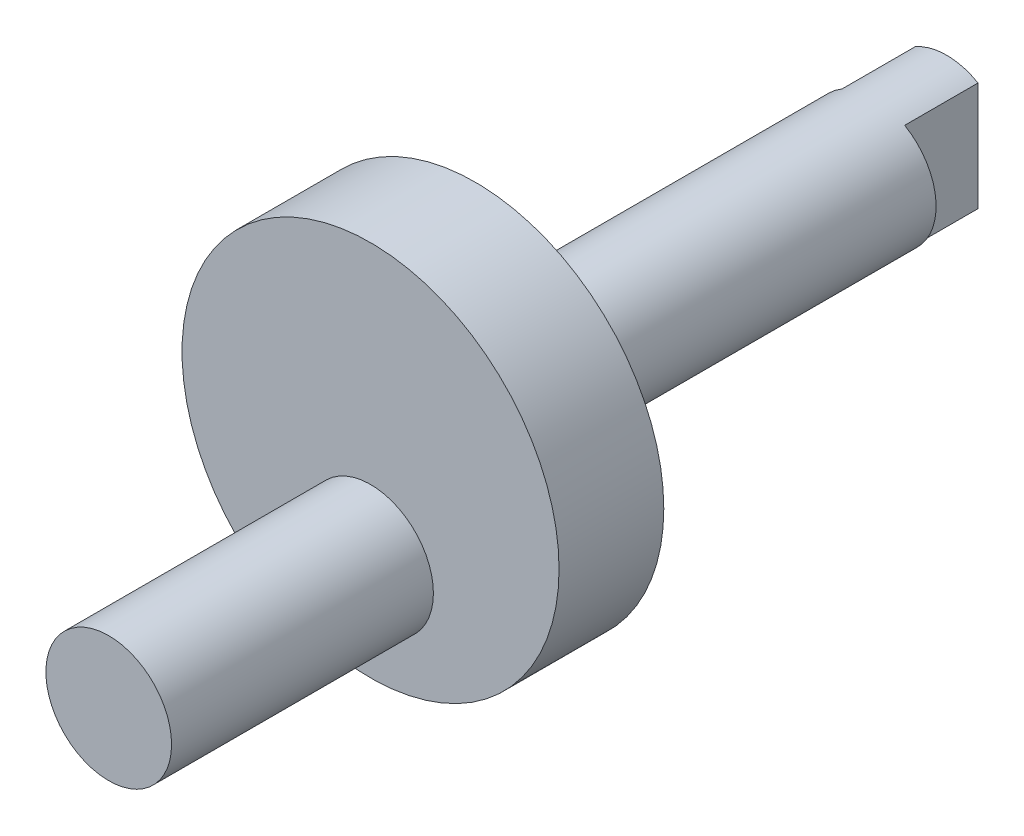
ISO-10303-21;
HEADER;
FILE_DESCRIPTION(('STEP AP214'),'2;1');
FILE_NAME('part.step','',(''),(''),'','','');
FILE_SCHEMA(('AUTOMOTIVE_DESIGN { 1 0 10303 214 1 1 1 1 }'));
ENDSEC;
DATA;
#1=APPLICATION_CONTEXT('core data for automotive mechanical design processes');
#2=APPLICATION_PROTOCOL_DEFINITION('international standard','automotive_design',2000,#1);
#3=PRODUCT_CONTEXT('',#1,'mechanical');
#4=PRODUCT('Part','Part','',(#3));
#5=PRODUCT_RELATED_PRODUCT_CATEGORY('part','',(#4));
#6=PRODUCT_DEFINITION_FORMATION('','',#4);
#7=PRODUCT_DEFINITION_CONTEXT('part definition',#1,'design');
#8=PRODUCT_DEFINITION('design','',#6,#7);
#9=PRODUCT_DEFINITION_SHAPE('','',#8);
#10=(LENGTH_UNIT() NAMED_UNIT(*) SI_UNIT(.MILLI.,.METRE.));
#11=(NAMED_UNIT(*) PLANE_ANGLE_UNIT() SI_UNIT($,.RADIAN.));
#12=(NAMED_UNIT(*) SI_UNIT($,.STERADIAN.) SOLID_ANGLE_UNIT());
#13=UNCERTAINTY_MEASURE_WITH_UNIT(LENGTH_MEASURE(1.E-05),#10,'distance_accuracy_value','');
#14=(GEOMETRIC_REPRESENTATION_CONTEXT(3) GLOBAL_UNCERTAINTY_ASSIGNED_CONTEXT((#13)) GLOBAL_UNIT_ASSIGNED_CONTEXT((#10,
#11,#12)) REPRESENTATION_CONTEXT('',''));
#15=CARTESIAN_POINT('',(0.,0.,0.));
#16=DIRECTION('',(0.,0.,1.));
#17=DIRECTION('',(1.,0.,0.));
#18=AXIS2_PLACEMENT_3D('',#15,#16,#17);
#19=CARTESIAN_POINT('',(0.,0.,45.));
#20=DIRECTION('',(0.,0.,-1.));
#21=DIRECTION('',(-1.,0.,0.));
#22=AXIS2_PLACEMENT_3D('',#19,#20,#21);
#23=CYLINDRICAL_SURFACE('',#22,6.);
#24=CARTESIAN_POINT('',(0.,0.,45.));
#25=DIRECTION('',(0.,0.,1.));
#26=DIRECTION('',(1.,0.,0.));
#27=AXIS2_PLACEMENT_3D('',#24,#25,#26);
#28=CIRCLE('',#27,6.);
#29=CARTESIAN_POINT('',(6.,0.,45.));
#30=VERTEX_POINT('',#29);
#31=EDGE_CURVE('E94',#30,#30,#28,.T.);
#32=ORIENTED_EDGE('',*,*,#31,.F.);
#33=EDGE_LOOP('',(#32));
#34=FACE_BOUND('',#33,.T.);
#35=CARTESIAN_POINT('',(0.,0.,7.));
#36=DIRECTION('',(0.,0.,-1.));
#37=DIRECTION('',(-1.,0.,0.));
#38=AXIS2_PLACEMENT_3D('',#35,#36,#37);
#39=CIRCLE('',#38,6.);
#40=CARTESIAN_POINT('',(3.,5.19615242270663,7.));
#41=VERTEX_POINT('',#40);
#42=CARTESIAN_POINT('',(3.,-5.19615242270663,7.));
#43=VERTEX_POINT('',#42);
#44=EDGE_CURVE('E11',#41,#43,#39,.T.);
#45=ORIENTED_EDGE('',*,*,#44,.F.);
#46=DIRECTION('',(0.,0.,-1.));
#47=VECTOR('',#46,1.);
#48=CARTESIAN_POINT('',(3.,5.19615242270663,45.));
#49=LINE('',#48,#47);
#50=CARTESIAN_POINT('',(3.,5.19615242270663,0.));
#51=VERTEX_POINT('',#50);
#52=EDGE_CURVE('E169',#41,#51,#49,.T.);
#53=ORIENTED_EDGE('',*,*,#52,.T.);
#54=CARTESIAN_POINT('',(0.,0.,0.));
#55=DIRECTION('',(0.,0.,1.));
#56=DIRECTION('',(1.,0.,0.));
#57=AXIS2_PLACEMENT_3D('',#54,#55,#56);
#58=CIRCLE('',#57,6.);
#59=CARTESIAN_POINT('',(-3.,5.19615242270663,0.));
#60=VERTEX_POINT('',#59);
#61=EDGE_CURVE('E105',#51,#60,#58,.T.);
#62=ORIENTED_EDGE('',*,*,#61,.T.);
#63=DIRECTION('',(0.,0.,-1.));
#64=VECTOR('',#63,1.);
#65=CARTESIAN_POINT('',(-3.,5.19615242270663,45.));
#66=LINE('',#65,#64);
#67=CARTESIAN_POINT('',(-3.,5.19615242270663,7.));
#68=VERTEX_POINT('',#67);
#69=EDGE_CURVE('E67',#60,#68,#66,.F.);
#70=ORIENTED_EDGE('',*,*,#69,.T.);
#71=CARTESIAN_POINT('',(0.,0.,7.));
#72=DIRECTION('',(0.,0.,1.));
#73=DIRECTION('',(1.,0.,0.));
#74=AXIS2_PLACEMENT_3D('',#71,#72,#73);
#75=CIRCLE('',#74,6.);
#76=CARTESIAN_POINT('',(-3.,-5.19615242270663,7.));
#77=VERTEX_POINT('',#76);
#78=EDGE_CURVE('E52',#68,#77,#75,.T.);
#79=ORIENTED_EDGE('',*,*,#78,.T.);
#80=DIRECTION('',(0.,0.,-1.));
#81=VECTOR('',#80,1.);
#82=CARTESIAN_POINT('',(-3.,-5.19615242270663,45.));
#83=LINE('',#82,#81);
#84=CARTESIAN_POINT('',(-3.,-5.19615242270663,0.));
#85=VERTEX_POINT('',#84);
#86=EDGE_CURVE('E86',#77,#85,#83,.T.);
#87=ORIENTED_EDGE('',*,*,#86,.T.);
#88=CARTESIAN_POINT('',(3.,-5.19615242270663,0.));
#89=VERTEX_POINT('',#88);
#90=EDGE_CURVE('E100',#85,#89,#58,.T.);
#91=ORIENTED_EDGE('',*,*,#90,.T.);
#92=DIRECTION('',(0.,0.,-1.));
#93=VECTOR('',#92,1.);
#94=CARTESIAN_POINT('',(3.,-5.19615242270663,45.));
#95=LINE('',#94,#93);
#96=EDGE_CURVE('E59',#89,#43,#95,.F.);
#97=ORIENTED_EDGE('',*,*,#96,.T.);
#98=EDGE_LOOP('',(#45,#53,#62,#70,#79,#87,#91,#97));
#99=FACE_BOUND('',#98,.T.);
#100=ADVANCED_FACE('F44',(#34,#99),#23,.T.);
#101=CARTESIAN_POINT('',(0.,0.,0.));
#102=DIRECTION('',(0.,0.,1.));
#103=DIRECTION('',(1.,0.,0.));
#104=AXIS2_PLACEMENT_3D('',#101,#102,#103);
#105=PLANE('',#104);
#106=ORIENTED_EDGE('',*,*,#61,.F.);
#107=DIRECTION('',(0.,-1.,0.));
#108=VECTOR('',#107,1.);
#109=CARTESIAN_POINT('',(3.,0.,0.));
#110=LINE('',#109,#108);
#111=EDGE_CURVE('E93',#51,#89,#110,.T.);
#112=ORIENTED_EDGE('',*,*,#111,.T.);
#113=ORIENTED_EDGE('',*,*,#90,.F.);
#114=DIRECTION('',(0.,1.,0.));
#115=VECTOR('',#114,1.);
#116=CARTESIAN_POINT('',(-3.,0.,0.));
#117=LINE('',#116,#115);
#118=EDGE_CURVE('E83',#85,#60,#117,.T.);
#119=ORIENTED_EDGE('',*,*,#118,.T.);
#120=EDGE_LOOP('',(#106,#112,#113,#119));
#121=FACE_BOUND('',#120,.T.);
#122=ADVANCED_FACE('F103',(#121),#105,.F.);
#123=CARTESIAN_POINT('',(0.,0.,55.));
#124=DIRECTION('',(0.,0.,-1.));
#125=DIRECTION('',(-1.,0.,0.));
#126=AXIS2_PLACEMENT_3D('',#123,#124,#125);
#127=CYLINDRICAL_SURFACE('',#126,18.);
#128=CARTESIAN_POINT('',(0.,0.,55.));
#129=DIRECTION('',(0.,0.,1.));
#130=DIRECTION('',(1.,0.,0.));
#131=AXIS2_PLACEMENT_3D('',#128,#129,#130);
#132=CIRCLE('',#131,18.);
#133=CARTESIAN_POINT('',(18.,0.,55.));
#134=VERTEX_POINT('',#133);
#135=EDGE_CURVE('E106',#134,#134,#132,.T.);
#136=ORIENTED_EDGE('',*,*,#135,.F.);
#137=EDGE_LOOP('',(#136));
#138=FACE_BOUND('',#137,.T.);
#139=CARTESIAN_POINT('',(0.,0.,45.));
#140=DIRECTION('',(0.,0.,1.));
#141=DIRECTION('',(1.,0.,0.));
#142=AXIS2_PLACEMENT_3D('',#139,#140,#141);
#143=CIRCLE('',#142,18.);
#144=CARTESIAN_POINT('',(18.,0.,45.));
#145=VERTEX_POINT('',#144);
#146=EDGE_CURVE('E111',#145,#145,#143,.T.);
#147=ORIENTED_EDGE('',*,*,#146,.T.);
#148=EDGE_LOOP('',(#147));
#149=FACE_BOUND('',#148,.T.);
#150=ADVANCED_FACE('F130',(#138,#149),#127,.T.);
#151=CARTESIAN_POINT('',(0.,0.,55.));
#152=DIRECTION('',(0.,0.,1.));
#153=DIRECTION('',(1.,0.,0.));
#154=AXIS2_PLACEMENT_3D('',#151,#152,#153);
#155=PLANE('',#154);
#156=CARTESIAN_POINT('',(0.,-8.,55.));
#157=DIRECTION('',(0.,0.,1.));
#158=DIRECTION('',(1.,0.,0.));
#159=AXIS2_PLACEMENT_3D('',#156,#157,#158);
#160=CIRCLE('',#159,6.);
#161=CARTESIAN_POINT('',(6.,-8.,55.));
#162=VERTEX_POINT('',#161);
#163=EDGE_CURVE('E176',#162,#162,#160,.T.);
#164=ORIENTED_EDGE('',*,*,#163,.F.);
#165=EDGE_LOOP('',(#164));
#166=FACE_BOUND('',#165,.T.);
#167=ORIENTED_EDGE('',*,*,#135,.T.);
#168=EDGE_LOOP('',(#167));
#169=FACE_BOUND('',#168,.T.);
#170=ADVANCED_FACE('F135',(#166,#169),#155,.T.);
#171=CARTESIAN_POINT('',(0.,0.,45.));
#172=DIRECTION('',(0.,0.,1.));
#173=DIRECTION('',(1.,0.,0.));
#174=AXIS2_PLACEMENT_3D('',#171,#172,#173);
#175=PLANE('',#174);
#176=ORIENTED_EDGE('',*,*,#31,.T.);
#177=EDGE_LOOP('',(#176));
#178=FACE_BOUND('',#177,.T.);
#179=ORIENTED_EDGE('',*,*,#146,.F.);
#180=EDGE_LOOP('',(#179));
#181=FACE_BOUND('',#180,.T.);
#182=ADVANCED_FACE('F122',(#178,#181),#175,.F.);
#183=CARTESIAN_POINT('',(0.,-8.,80.));
#184=DIRECTION('',(0.,0.,-1.));
#185=DIRECTION('',(-1.,0.,0.));
#186=AXIS2_PLACEMENT_3D('',#183,#184,#185);
#187=CYLINDRICAL_SURFACE('',#186,6.);
#188=CARTESIAN_POINT('',(0.,-8.,80.));
#189=DIRECTION('',(0.,0.,1.));
#190=DIRECTION('',(1.,0.,0.));
#191=AXIS2_PLACEMENT_3D('',#188,#189,#190);
#192=CIRCLE('',#191,6.);
#193=CARTESIAN_POINT('',(6.,-8.,80.));
#194=VERTEX_POINT('',#193);
#195=EDGE_CURVE('E180',#194,#194,#192,.T.);
#196=ORIENTED_EDGE('',*,*,#195,.F.);
#197=EDGE_LOOP('',(#196));
#198=FACE_BOUND('',#197,.T.);
#199=ORIENTED_EDGE('',*,*,#163,.T.);
#200=EDGE_LOOP('',(#199));
#201=FACE_BOUND('',#200,.T.);
#202=ADVANCED_FACE('F141',(#198,#201),#187,.T.);
#203=CARTESIAN_POINT('',(0.,-8.,80.));
#204=DIRECTION('',(0.,0.,1.));
#205=DIRECTION('',(1.,0.,0.));
#206=AXIS2_PLACEMENT_3D('',#203,#204,#205);
#207=PLANE('',#206);
#208=ORIENTED_EDGE('',*,*,#195,.T.);
#209=EDGE_LOOP('',(#208));
#210=FACE_BOUND('',#209,.T.);
#211=ADVANCED_FACE('F147',(#210),#207,.T.);
#212=CARTESIAN_POINT('',(0.,0.,7.));
#213=DIRECTION('',(0.,0.,1.));
#214=DIRECTION('',(1.,0.,0.));
#215=AXIS2_PLACEMENT_3D('',#212,#213,#214);
#216=PLANE('',#215);
#217=DIRECTION('',(0.,-1.,0.));
#218=VECTOR('',#217,1.);
#219=CARTESIAN_POINT('',(-3.,7.13175142774347,7.));
#220=LINE('',#219,#218);
#221=EDGE_CURVE('E171',#68,#77,#220,.T.);
#222=ORIENTED_EDGE('',*,*,#221,.T.);
#223=ORIENTED_EDGE('',*,*,#78,.F.);
#224=EDGE_LOOP('',(#222,#223));
#225=FACE_BOUND('',#224,.T.);
#226=ADVANCED_FACE('F151',(#225),#216,.F.);
#227=CARTESIAN_POINT('',(-3.,7.13175142774347,7.));
#228=DIRECTION('',(1.,0.,0.));
#229=DIRECTION('',(0.,1.,0.));
#230=AXIS2_PLACEMENT_3D('',#227,#228,#229);
#231=PLANE('',#230);
#232=ORIENTED_EDGE('',*,*,#221,.F.);
#233=ORIENTED_EDGE('',*,*,#69,.F.);
#234=ORIENTED_EDGE('',*,*,#118,.F.);
#235=ORIENTED_EDGE('',*,*,#86,.F.);
#236=EDGE_LOOP('',(#232,#233,#234,#235));
#237=FACE_BOUND('',#236,.T.);
#238=ADVANCED_FACE('F85',(#237),#231,.F.);
#239=CARTESIAN_POINT('',(0.,0.,7.));
#240=DIRECTION('',(0.,0.,-1.));
#241=DIRECTION('',(-1.,0.,0.));
#242=AXIS2_PLACEMENT_3D('',#239,#240,#241);
#243=PLANE('',#242);
#244=ORIENTED_EDGE('',*,*,#44,.T.);
#245=DIRECTION('',(0.,1.,0.));
#246=VECTOR('',#245,1.);
#247=CARTESIAN_POINT('',(3.,5.30062606116076,7.));
#248=LINE('',#247,#246);
#249=EDGE_CURVE('E167',#43,#41,#248,.T.);
#250=ORIENTED_EDGE('',*,*,#249,.T.);
#251=EDGE_LOOP('',(#244,#250));
#252=FACE_BOUND('',#251,.T.);
#253=ADVANCED_FACE('F158',(#252),#243,.T.);
#254=CARTESIAN_POINT('',(3.,5.30062606116076,7.));
#255=DIRECTION('',(-1.,0.,0.));
#256=DIRECTION('',(0.,-1.,0.));
#257=AXIS2_PLACEMENT_3D('',#254,#255,#256);
#258=PLANE('',#257);
#259=ORIENTED_EDGE('',*,*,#249,.F.);
#260=ORIENTED_EDGE('',*,*,#96,.F.);
#261=ORIENTED_EDGE('',*,*,#111,.F.);
#262=ORIENTED_EDGE('',*,*,#52,.F.);
#263=EDGE_LOOP('',(#259,#260,#261,#262));
#264=FACE_BOUND('',#263,.T.);
#265=ADVANCED_FACE('F159',(#264),#258,.F.);
#266=CLOSED_SHELL('',(#100,#122,#150,#170,#182,#202,#211,#226,#238,#253,#265));
#267=MANIFOLD_SOLID_BREP('B2',#266);
#268=ADVANCED_BREP_SHAPE_REPRESENTATION('',(#18,#267),#14);
#269=SHAPE_DEFINITION_REPRESENTATION(#9,#268);
ENDSEC;
END-ISO-10303-21;
